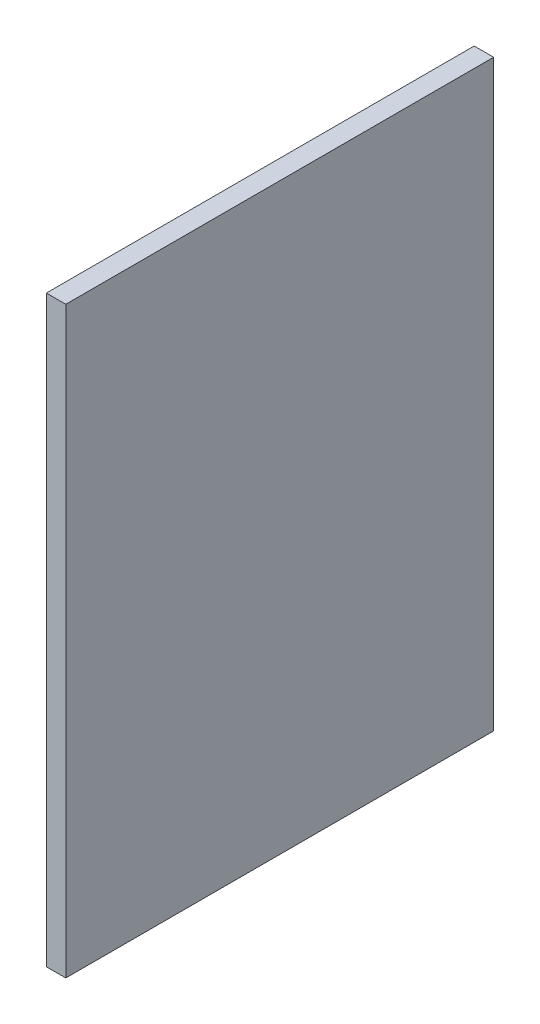
ISO-10303-21;
HEADER;
FILE_DESCRIPTION(('STEP AP214'),'2;1');
FILE_NAME('part.step','',(''),(''),'','','');
FILE_SCHEMA(('AUTOMOTIVE_DESIGN { 1 0 10303 214 1 1 1 1 }'));
ENDSEC;
DATA;
#1=APPLICATION_CONTEXT('core data for automotive mechanical design processes');
#2=APPLICATION_PROTOCOL_DEFINITION('international standard','automotive_design',2000,#1);
#3=PRODUCT_CONTEXT('',#1,'mechanical');
#4=PRODUCT('Part','Part','',(#3));
#5=PRODUCT_RELATED_PRODUCT_CATEGORY('part','',(#4));
#6=PRODUCT_DEFINITION_FORMATION('','',#4);
#7=PRODUCT_DEFINITION_CONTEXT('part definition',#1,'design');
#8=PRODUCT_DEFINITION('design','',#6,#7);
#9=PRODUCT_DEFINITION_SHAPE('','',#8);
#10=(LENGTH_UNIT() NAMED_UNIT(*) SI_UNIT(.MILLI.,.METRE.));
#11=(NAMED_UNIT(*) PLANE_ANGLE_UNIT() SI_UNIT($,.RADIAN.));
#12=(NAMED_UNIT(*) SI_UNIT($,.STERADIAN.) SOLID_ANGLE_UNIT());
#13=UNCERTAINTY_MEASURE_WITH_UNIT(LENGTH_MEASURE(1.E-05),#10,'distance_accuracy_value','');
#14=(GEOMETRIC_REPRESENTATION_CONTEXT(3) GLOBAL_UNCERTAINTY_ASSIGNED_CONTEXT((#13)) GLOBAL_UNIT_ASSIGNED_CONTEXT((#10,
#11,#12)) REPRESENTATION_CONTEXT('',''));
#15=CARTESIAN_POINT('',(0.,0.,0.));
#16=DIRECTION('',(0.,0.,1.));
#17=DIRECTION('',(1.,0.,0.));
#18=AXIS2_PLACEMENT_3D('',#15,#16,#17);
#19=CARTESIAN_POINT('',(5.,75.,-55.));
#20=DIRECTION('',(0.,0.,1.));
#21=DIRECTION('',(1.,0.,0.));
#22=AXIS2_PLACEMENT_3D('',#19,#20,#21);
#23=PLANE('',#22);
#24=DIRECTION('',(0.,1.,0.));
#25=VECTOR('',#24,1.);
#26=CARTESIAN_POINT('',(0.,75.,-55.));
#27=LINE('',#26,#25);
#28=CARTESIAN_POINT('',(0.,-75.,-55.));
#29=VERTEX_POINT('',#28);
#30=CARTESIAN_POINT('',(0.,75.,-55.));
#31=VERTEX_POINT('',#30);
#32=EDGE_CURVE('E95',#29,#31,#27,.T.);
#33=ORIENTED_EDGE('',*,*,#32,.T.);
#34=DIRECTION('',(-1.,0.,0.));
#35=VECTOR('',#34,1.);
#36=CARTESIAN_POINT('',(5.,75.,-55.));
#37=LINE('',#36,#35);
#38=CARTESIAN_POINT('',(5.,75.,-55.));
#39=VERTEX_POINT('',#38);
#40=EDGE_CURVE('E11',#39,#31,#37,.T.);
#41=ORIENTED_EDGE('',*,*,#40,.F.);
#42=DIRECTION('',(0.,1.,0.));
#43=VECTOR('',#42,1.);
#44=CARTESIAN_POINT('',(5.,75.,-55.));
#45=LINE('',#44,#43);
#46=CARTESIAN_POINT('',(5.,-75.,-55.));
#47=VERTEX_POINT('',#46);
#48=EDGE_CURVE('E83',#47,#39,#45,.T.);
#49=ORIENTED_EDGE('',*,*,#48,.F.);
#50=DIRECTION('',(-1.,0.,0.));
#51=VECTOR('',#50,1.);
#52=CARTESIAN_POINT('',(5.,-75.,-55.));
#53=LINE('',#52,#51);
#54=EDGE_CURVE('E91',#47,#29,#53,.T.);
#55=ORIENTED_EDGE('',*,*,#54,.T.);
#56=EDGE_LOOP('',(#33,#41,#49,#55));
#57=FACE_BOUND('',#56,.T.);
#58=ADVANCED_FACE('F32',(#57),#23,.F.);
#59=CARTESIAN_POINT('',(5.,75.,55.));
#60=DIRECTION('',(0.,-1.,0.));
#61=DIRECTION('',(0.,0.,-1.));
#62=AXIS2_PLACEMENT_3D('',#59,#60,#61);
#63=PLANE('',#62);
#64=DIRECTION('',(0.,0.,1.));
#65=VECTOR('',#64,1.);
#66=CARTESIAN_POINT('',(0.,75.,55.));
#67=LINE('',#66,#65);
#68=CARTESIAN_POINT('',(0.,75.,55.));
#69=VERTEX_POINT('',#68);
#70=EDGE_CURVE('E87',#31,#69,#67,.T.);
#71=ORIENTED_EDGE('',*,*,#70,.T.);
#72=DIRECTION('',(-1.,0.,0.));
#73=VECTOR('',#72,1.);
#74=CARTESIAN_POINT('',(5.,75.,55.));
#75=LINE('',#74,#73);
#76=CARTESIAN_POINT('',(5.,75.,55.));
#77=VERTEX_POINT('',#76);
#78=EDGE_CURVE('E40',#77,#69,#75,.T.);
#79=ORIENTED_EDGE('',*,*,#78,.F.);
#80=DIRECTION('',(0.,0.,1.));
#81=VECTOR('',#80,1.);
#82=CARTESIAN_POINT('',(5.,75.,55.));
#83=LINE('',#82,#81);
#84=EDGE_CURVE('E78',#39,#77,#83,.T.);
#85=ORIENTED_EDGE('',*,*,#84,.F.);
#86=ORIENTED_EDGE('',*,*,#40,.T.);
#87=EDGE_LOOP('',(#71,#79,#85,#86));
#88=FACE_BOUND('',#87,.T.);
#89=ADVANCED_FACE('F86',(#88),#63,.F.);
#90=CARTESIAN_POINT('',(5.,75.,55.));
#91=DIRECTION('',(0.,0.,-1.));
#92=DIRECTION('',(0.,1.,0.));
#93=AXIS2_PLACEMENT_3D('',#90,#91,#92);
#94=PLANE('',#93);
#95=DIRECTION('',(0.,-1.,0.));
#96=VECTOR('',#95,1.);
#97=CARTESIAN_POINT('',(0.,75.,55.));
#98=LINE('',#97,#96);
#99=CARTESIAN_POINT('',(0.,-75.,55.));
#100=VERTEX_POINT('',#99);
#101=EDGE_CURVE('E65',#69,#100,#98,.T.);
#102=ORIENTED_EDGE('',*,*,#101,.T.);
#103=DIRECTION('',(-1.,0.,0.));
#104=VECTOR('',#103,1.);
#105=CARTESIAN_POINT('',(5.,-75.,55.));
#106=LINE('',#105,#104);
#107=CARTESIAN_POINT('',(5.,-75.,55.));
#108=VERTEX_POINT('',#107);
#109=EDGE_CURVE('E88',#108,#100,#106,.T.);
#110=ORIENTED_EDGE('',*,*,#109,.F.);
#111=DIRECTION('',(0.,-1.,0.));
#112=VECTOR('',#111,1.);
#113=CARTESIAN_POINT('',(5.,75.,55.));
#114=LINE('',#113,#112);
#115=EDGE_CURVE('E81',#77,#108,#114,.T.);
#116=ORIENTED_EDGE('',*,*,#115,.F.);
#117=ORIENTED_EDGE('',*,*,#78,.T.);
#118=EDGE_LOOP('',(#102,#110,#116,#117));
#119=FACE_BOUND('',#118,.T.);
#120=ADVANCED_FACE('F89',(#119),#94,.F.);
#121=CARTESIAN_POINT('',(5.,-75.,55.));
#122=DIRECTION('',(0.,1.,0.));
#123=DIRECTION('',(0.,0.,1.));
#124=AXIS2_PLACEMENT_3D('',#121,#122,#123);
#125=PLANE('',#124);
#126=DIRECTION('',(0.,0.,-1.));
#127=VECTOR('',#126,1.);
#128=CARTESIAN_POINT('',(0.,-75.,55.));
#129=LINE('',#128,#127);
#130=EDGE_CURVE('E71',#100,#29,#129,.T.);
#131=ORIENTED_EDGE('',*,*,#130,.T.);
#132=ORIENTED_EDGE('',*,*,#54,.F.);
#133=DIRECTION('',(0.,0.,-1.));
#134=VECTOR('',#133,1.);
#135=CARTESIAN_POINT('',(5.,-75.,55.));
#136=LINE('',#135,#134);
#137=EDGE_CURVE('E48',#108,#47,#136,.T.);
#138=ORIENTED_EDGE('',*,*,#137,.F.);
#139=ORIENTED_EDGE('',*,*,#109,.T.);
#140=EDGE_LOOP('',(#131,#132,#138,#139));
#141=FACE_BOUND('',#140,.T.);
#142=ADVANCED_FACE('F102',(#141),#125,.F.);
#143=CARTESIAN_POINT('',(5.,0.,0.));
#144=DIRECTION('',(1.,0.,0.));
#145=DIRECTION('',(0.,0.,-1.));
#146=AXIS2_PLACEMENT_3D('',#143,#144,#145);
#147=PLANE('',#146);
#148=ORIENTED_EDGE('',*,*,#48,.T.);
#149=ORIENTED_EDGE('',*,*,#84,.T.);
#150=ORIENTED_EDGE('',*,*,#115,.T.);
#151=ORIENTED_EDGE('',*,*,#137,.T.);
#152=EDGE_LOOP('',(#148,#149,#150,#151));
#153=FACE_BOUND('',#152,.T.);
#154=ADVANCED_FACE('F79',(#153),#147,.T.);
#155=CARTESIAN_POINT('',(0.,0.,0.));
#156=DIRECTION('',(1.,0.,0.));
#157=DIRECTION('',(0.,0.,-1.));
#158=AXIS2_PLACEMENT_3D('',#155,#156,#157);
#159=PLANE('',#158);
#160=ORIENTED_EDGE('',*,*,#32,.F.);
#161=ORIENTED_EDGE('',*,*,#130,.F.);
#162=ORIENTED_EDGE('',*,*,#101,.F.);
#163=ORIENTED_EDGE('',*,*,#70,.F.);
#164=EDGE_LOOP('',(#160,#161,#162,#163));
#165=FACE_BOUND('',#164,.T.);
#166=ADVANCED_FACE('F105',(#165),#159,.F.);
#167=CLOSED_SHELL('',(#58,#89,#120,#142,#154,#166));
#168=MANIFOLD_SOLID_BREP('B2',#167);
#169=ADVANCED_BREP_SHAPE_REPRESENTATION('',(#18,#168),#14);
#170=SHAPE_DEFINITION_REPRESENTATION(#9,#169);
ENDSEC;
END-ISO-10303-21;
